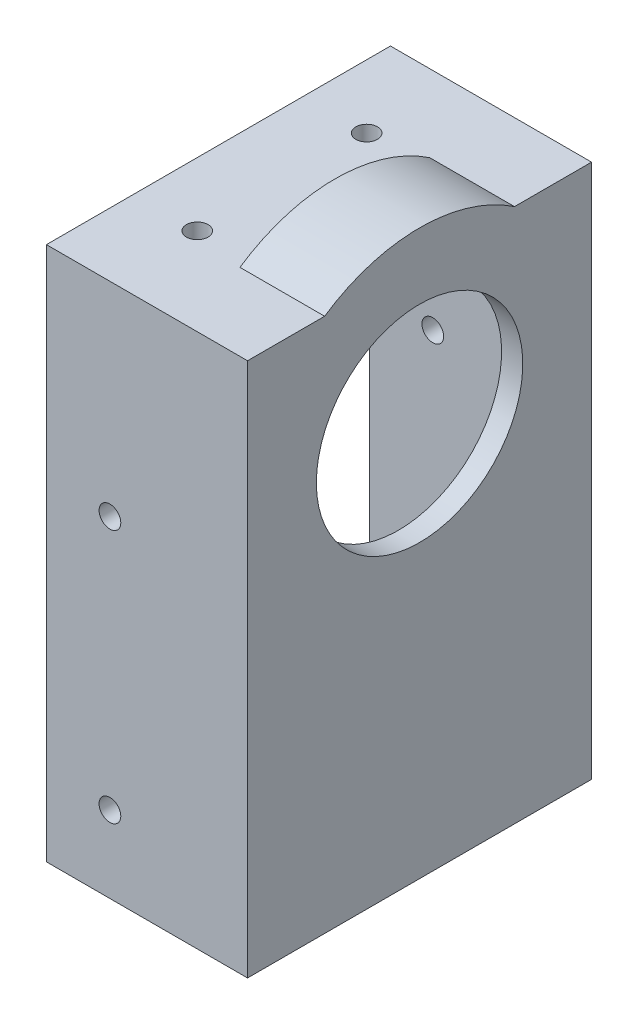
ISO-10303-21;
HEADER;
FILE_DESCRIPTION(('STEP AP214'),'2;1');
FILE_NAME('part.step','',(''),(''),'','','');
FILE_SCHEMA(('AUTOMOTIVE_DESIGN { 1 0 10303 214 1 1 1 1 }'));
ENDSEC;
DATA;
#1=APPLICATION_CONTEXT('core data for automotive mechanical design processes');
#2=APPLICATION_PROTOCOL_DEFINITION('international standard','automotive_design',2000,#1);
#3=PRODUCT_CONTEXT('',#1,'mechanical');
#4=PRODUCT('Part','Part','',(#3));
#5=PRODUCT_RELATED_PRODUCT_CATEGORY('part','',(#4));
#6=PRODUCT_DEFINITION_FORMATION('','',#4);
#7=PRODUCT_DEFINITION_CONTEXT('part definition',#1,'design');
#8=PRODUCT_DEFINITION('design','',#6,#7);
#9=PRODUCT_DEFINITION_SHAPE('','',#8);
#10=(LENGTH_UNIT() NAMED_UNIT(*) SI_UNIT(.MILLI.,.METRE.));
#11=(NAMED_UNIT(*) PLANE_ANGLE_UNIT() SI_UNIT($,.RADIAN.));
#12=(NAMED_UNIT(*) SI_UNIT($,.STERADIAN.) SOLID_ANGLE_UNIT());
#13=UNCERTAINTY_MEASURE_WITH_UNIT(LENGTH_MEASURE(1.E-05),#10,'distance_accuracy_value','');
#14=(GEOMETRIC_REPRESENTATION_CONTEXT(3) GLOBAL_UNCERTAINTY_ASSIGNED_CONTEXT((#13)) GLOBAL_UNIT_ASSIGNED_CONTEXT((#10,
#11,#12)) REPRESENTATION_CONTEXT('',''));
#15=CARTESIAN_POINT('',(0.,0.,0.));
#16=DIRECTION('',(0.,0.,1.));
#17=DIRECTION('',(1.,0.,0.));
#18=AXIS2_PLACEMENT_3D('',#15,#16,#17);
#19=CARTESIAN_POINT('',(0.,0.,0.));
#20=DIRECTION('',(1.,0.,0.));
#21=DIRECTION('',(0.,0.,-1.));
#22=AXIS2_PLACEMENT_3D('',#19,#20,#21);
#23=PLANE('',#22);
#24=DIRECTION('',(0.,-1.,0.));
#25=VECTOR('',#24,1.);
#26=CARTESIAN_POINT('',(0.,0.,2.));
#27=LINE('',#26,#25);
#28=CARTESIAN_POINT('',(0.,48.5,2.));
#29=VERTEX_POINT('',#28);
#30=CARTESIAN_POINT('',(0.,-2.,2.));
#31=VERTEX_POINT('',#30);
#32=EDGE_CURVE('E289',#29,#31,#27,.T.);
#33=ORIENTED_EDGE('',*,*,#32,.F.);
#34=DIRECTION('',(0.,0.,1.));
#35=VECTOR('',#34,1.);
#36=CARTESIAN_POINT('',(0.,48.5,0.));
#37=LINE('',#36,#35);
#38=CARTESIAN_POINT('',(0.,48.5,-30.5));
#39=VERTEX_POINT('',#38);
#40=EDGE_CURVE('E299',#39,#29,#37,.T.);
#41=ORIENTED_EDGE('',*,*,#40,.F.);
#42=DIRECTION('',(0.,1.,0.));
#43=VECTOR('',#42,1.);
#44=CARTESIAN_POINT('',(0.,0.,-30.5));
#45=LINE('',#44,#43);
#46=CARTESIAN_POINT('',(0.,-2.,-30.5));
#47=VERTEX_POINT('',#46);
#48=EDGE_CURVE('E296',#47,#39,#45,.T.);
#49=ORIENTED_EDGE('',*,*,#48,.F.);
#50=DIRECTION('',(0.,0.,-1.));
#51=VECTOR('',#50,1.);
#52=CARTESIAN_POINT('',(0.,-2.,0.));
#53=LINE('',#52,#51);
#54=EDGE_CURVE('E293',#31,#47,#53,.T.);
#55=ORIENTED_EDGE('',*,*,#54,.F.);
#56=EDGE_LOOP('',(#33,#41,#49,#55));
#57=FACE_BOUND('',#56,.T.);
#58=DIRECTION('',(0.,-1.,0.));
#59=VECTOR('',#58,1.);
#60=CARTESIAN_POINT('',(0.,0.,0.));
#61=LINE('',#60,#59);
#62=CARTESIAN_POINT('',(0.,46.5,0.));
#63=VERTEX_POINT('',#62);
#64=CARTESIAN_POINT('',(0.,0.,0.));
#65=VERTEX_POINT('',#64);
#66=EDGE_CURVE('E245',#63,#65,#61,.T.);
#67=ORIENTED_EDGE('',*,*,#66,.T.);
#68=DIRECTION('',(0.,0.,-1.));
#69=VECTOR('',#68,1.);
#70=CARTESIAN_POINT('',(0.,0.,0.));
#71=LINE('',#70,#69);
#72=CARTESIAN_POINT('',(0.,0.,-28.5));
#73=VERTEX_POINT('',#72);
#74=EDGE_CURVE('E265',#65,#73,#71,.T.);
#75=ORIENTED_EDGE('',*,*,#74,.T.);
#76=DIRECTION('',(0.,1.,0.));
#77=VECTOR('',#76,1.);
#78=CARTESIAN_POINT('',(0.,0.,-28.5));
#79=LINE('',#78,#77);
#80=CARTESIAN_POINT('',(0.,46.5,-28.5));
#81=VERTEX_POINT('',#80);
#82=EDGE_CURVE('E269',#73,#81,#79,.T.);
#83=ORIENTED_EDGE('',*,*,#82,.T.);
#84=DIRECTION('',(0.,0.,1.));
#85=VECTOR('',#84,1.);
#86=CARTESIAN_POINT('',(0.,46.5,0.));
#87=LINE('',#86,#85);
#88=EDGE_CURVE('E251',#81,#63,#87,.T.);
#89=ORIENTED_EDGE('',*,*,#88,.T.);
#90=EDGE_LOOP('',(#67,#75,#83,#89));
#91=FACE_BOUND('',#90,.T.);
#92=ADVANCED_FACE('F63',(#57,#91),#23,.F.);
#93=CARTESIAN_POINT('',(17.,0.,2.));
#94=DIRECTION('',(0.,0.,-1.));
#95=DIRECTION('',(-1.,0.,0.));
#96=AXIS2_PLACEMENT_3D('',#93,#94,#95);
#97=PLANE('',#96);
#98=CARTESIAN_POINT('',(6.,29.25,2.));
#99=DIRECTION('',(0.,0.,1.));
#100=DIRECTION('',(1.,0.,0.));
#101=AXIS2_PLACEMENT_3D('',#98,#99,#100);
#102=CIRCLE('',#101,1.025);
#103=CARTESIAN_POINT('',(7.025,29.25,2.));
#104=VERTEX_POINT('',#103);
#105=EDGE_CURVE('E219',#104,#104,#102,.T.);
#106=ORIENTED_EDGE('',*,*,#105,.F.);
#107=EDGE_LOOP('',(#106));
#108=FACE_BOUND('',#107,.T.);
#109=CARTESIAN_POINT('',(6.,5.25,2.));
#110=DIRECTION('',(0.,0.,1.));
#111=DIRECTION('',(1.,0.,0.));
#112=AXIS2_PLACEMENT_3D('',#109,#110,#111);
#113=CIRCLE('',#112,1.025);
#114=CARTESIAN_POINT('',(7.025,5.25,2.));
#115=VERTEX_POINT('',#114);
#116=EDGE_CURVE('E232',#115,#115,#113,.T.);
#117=ORIENTED_EDGE('',*,*,#116,.F.);
#118=EDGE_LOOP('',(#117));
#119=FACE_BOUND('',#118,.T.);
#120=ORIENTED_EDGE('',*,*,#32,.T.);
#121=DIRECTION('',(-1.,0.,0.));
#122=VECTOR('',#121,1.);
#123=CARTESIAN_POINT('',(17.,-2.,2.));
#124=LINE('',#123,#122);
#125=CARTESIAN_POINT('',(19.,-2.,2.));
#126=VERTEX_POINT('',#125);
#127=EDGE_CURVE('E12',#126,#31,#124,.T.);
#128=ORIENTED_EDGE('',*,*,#127,.F.);
#129=DIRECTION('',(0.,-1.,0.));
#130=VECTOR('',#129,1.);
#131=CARTESIAN_POINT('',(19.,-2.,2.));
#132=LINE('',#131,#130);
#133=CARTESIAN_POINT('',(19.,48.5,2.));
#134=VERTEX_POINT('',#133);
#135=EDGE_CURVE('E173',#134,#126,#132,.T.);
#136=ORIENTED_EDGE('',*,*,#135,.F.);
#137=DIRECTION('',(-1.,0.,0.));
#138=VECTOR('',#137,1.);
#139=CARTESIAN_POINT('',(17.,48.5,2.));
#140=LINE('',#139,#138);
#141=EDGE_CURVE('E302',#134,#29,#140,.T.);
#142=ORIENTED_EDGE('',*,*,#141,.T.);
#143=EDGE_LOOP('',(#120,#128,#136,#142));
#144=FACE_BOUND('',#143,.T.);
#145=ADVANCED_FACE('F65',(#108,#119,#144),#97,.F.);
#146=CARTESIAN_POINT('',(17.,-2.,0.));
#147=DIRECTION('',(0.,1.,0.));
#148=DIRECTION('',(0.,0.,1.));
#149=AXIS2_PLACEMENT_3D('',#146,#147,#148);
#150=PLANE('',#149);
#151=CARTESIAN_POINT('',(6.,-2.,-6.25));
#152=DIRECTION('',(0.,1.,0.));
#153=DIRECTION('',(0.,0.,1.));
#154=AXIS2_PLACEMENT_3D('',#151,#152,#153);
#155=CIRCLE('',#154,1.02499999999999);
#156=CARTESIAN_POINT('',(6.,-2.,-5.225));
#157=VERTEX_POINT('',#156);
#158=EDGE_CURVE('E195',#157,#157,#155,.T.);
#159=ORIENTED_EDGE('',*,*,#158,.T.);
#160=EDGE_LOOP('',(#159));
#161=FACE_BOUND('',#160,.T.);
#162=CARTESIAN_POINT('',(6.,-2.,-22.25));
#163=DIRECTION('',(0.,1.,0.));
#164=DIRECTION('',(0.,0.,1.));
#165=AXIS2_PLACEMENT_3D('',#162,#163,#164);
#166=CIRCLE('',#165,1.02499999999999);
#167=CARTESIAN_POINT('',(6.,-2.,-21.225));
#168=VERTEX_POINT('',#167);
#169=EDGE_CURVE('E211',#168,#168,#166,.T.);
#170=ORIENTED_EDGE('',*,*,#169,.T.);
#171=EDGE_LOOP('',(#170));
#172=FACE_BOUND('',#171,.T.);
#173=ORIENTED_EDGE('',*,*,#54,.T.);
#174=DIRECTION('',(-1.,0.,0.));
#175=VECTOR('',#174,1.);
#176=CARTESIAN_POINT('',(17.,-2.,-30.5));
#177=LINE('',#176,#175);
#178=CARTESIAN_POINT('',(19.,-2.,-30.5));
#179=VERTEX_POINT('',#178);
#180=EDGE_CURVE('E73',#179,#47,#177,.T.);
#181=ORIENTED_EDGE('',*,*,#180,.F.);
#182=DIRECTION('',(0.,0.,-1.));
#183=VECTOR('',#182,1.);
#184=CARTESIAN_POINT('',(19.,-2.,2.));
#185=LINE('',#184,#183);
#186=EDGE_CURVE('E180',#126,#179,#185,.T.);
#187=ORIENTED_EDGE('',*,*,#186,.F.);
#188=ORIENTED_EDGE('',*,*,#127,.T.);
#189=EDGE_LOOP('',(#173,#181,#187,#188));
#190=FACE_BOUND('',#189,.T.);
#191=ADVANCED_FACE('F357',(#161,#172,#190),#150,.F.);
#192=CARTESIAN_POINT('',(17.,0.,-30.5));
#193=DIRECTION('',(0.,0.,1.));
#194=DIRECTION('',(1.,0.,0.));
#195=AXIS2_PLACEMENT_3D('',#192,#193,#194);
#196=PLANE('',#195);
#197=CARTESIAN_POINT('',(6.,29.25,-30.5));
#198=DIRECTION('',(0.,0.,1.));
#199=DIRECTION('',(1.,0.,0.));
#200=AXIS2_PLACEMENT_3D('',#197,#198,#199);
#201=CIRCLE('',#200,1.025);
#202=CARTESIAN_POINT('',(7.025,29.25,-30.5));
#203=VERTEX_POINT('',#202);
#204=EDGE_CURVE('E223',#203,#203,#201,.T.);
#205=ORIENTED_EDGE('',*,*,#204,.T.);
#206=EDGE_LOOP('',(#205));
#207=FACE_BOUND('',#206,.T.);
#208=CARTESIAN_POINT('',(6.,5.25,-30.5));
#209=DIRECTION('',(0.,0.,1.));
#210=DIRECTION('',(1.,0.,0.));
#211=AXIS2_PLACEMENT_3D('',#208,#209,#210);
#212=CIRCLE('',#211,1.025);
#213=CARTESIAN_POINT('',(7.025,5.25,-30.5));
#214=VERTEX_POINT('',#213);
#215=EDGE_CURVE('E236',#214,#214,#212,.T.);
#216=ORIENTED_EDGE('',*,*,#215,.T.);
#217=EDGE_LOOP('',(#216));
#218=FACE_BOUND('',#217,.T.);
#219=ORIENTED_EDGE('',*,*,#48,.T.);
#220=DIRECTION('',(-1.,0.,0.));
#221=VECTOR('',#220,1.);
#222=CARTESIAN_POINT('',(17.,48.5,-30.5));
#223=LINE('',#222,#221);
#224=CARTESIAN_POINT('',(19.,48.5,-30.5));
#225=VERTEX_POINT('',#224);
#226=EDGE_CURVE('E306',#225,#39,#223,.T.);
#227=ORIENTED_EDGE('',*,*,#226,.F.);
#228=DIRECTION('',(0.,1.,0.));
#229=VECTOR('',#228,1.);
#230=CARTESIAN_POINT('',(19.,-2.,-30.5));
#231=LINE('',#230,#229);
#232=EDGE_CURVE('E184',#179,#225,#231,.T.);
#233=ORIENTED_EDGE('',*,*,#232,.F.);
#234=ORIENTED_EDGE('',*,*,#180,.T.);
#235=EDGE_LOOP('',(#219,#227,#233,#234));
#236=FACE_BOUND('',#235,.T.);
#237=ADVANCED_FACE('F363',(#207,#218,#236),#196,.F.);
#238=CARTESIAN_POINT('',(17.,48.5,0.));
#239=DIRECTION('',(0.,-1.,0.));
#240=DIRECTION('',(0.,0.,-1.));
#241=AXIS2_PLACEMENT_3D('',#238,#239,#240);
#242=PLANE('',#241);
#243=CARTESIAN_POINT('',(6.,48.5,-6.25));
#244=DIRECTION('',(0.,1.,0.));
#245=DIRECTION('',(0.,0.,1.));
#246=AXIS2_PLACEMENT_3D('',#243,#244,#245);
#247=CIRCLE('',#246,1.02499999999999);
#248=CARTESIAN_POINT('',(6.,48.5,-5.22500000000001));
#249=VERTEX_POINT('',#248);
#250=EDGE_CURVE('E191',#249,#249,#247,.T.);
#251=ORIENTED_EDGE('',*,*,#250,.F.);
#252=EDGE_LOOP('',(#251));
#253=FACE_BOUND('',#252,.T.);
#254=CARTESIAN_POINT('',(6.,48.5,-22.25));
#255=DIRECTION('',(0.,1.,0.));
#256=DIRECTION('',(0.,0.,1.));
#257=AXIS2_PLACEMENT_3D('',#254,#255,#256);
#258=CIRCLE('',#257,1.02499999999999);
#259=CARTESIAN_POINT('',(6.,48.5,-21.225));
#260=VERTEX_POINT('',#259);
#261=EDGE_CURVE('E207',#260,#260,#258,.T.);
#262=ORIENTED_EDGE('',*,*,#261,.F.);
#263=EDGE_LOOP('',(#262));
#264=FACE_BOUND('',#263,.T.);
#265=DIRECTION('',(0.,0.,-1.));
#266=VECTOR('',#265,1.);
#267=CARTESIAN_POINT('',(11.,48.5,-5.28130444267395));
#268=LINE('',#267,#266);
#269=CARTESIAN_POINT('',(11.,48.5,-5.28130444267395));
#270=VERTEX_POINT('',#269);
#271=CARTESIAN_POINT('',(11.,48.5,-23.2186955573261));
#272=VERTEX_POINT('',#271);
#273=EDGE_CURVE('E153',#270,#272,#268,.T.);
#274=ORIENTED_EDGE('',*,*,#273,.T.);
#275=DIRECTION('',(1.,0.,0.));
#276=VECTOR('',#275,1.);
#277=CARTESIAN_POINT('',(11.,48.5,-23.2186955573261));
#278=LINE('',#277,#276);
#279=CARTESIAN_POINT('',(19.,48.5,-23.2186955573261));
#280=VERTEX_POINT('',#279);
#281=EDGE_CURVE('E149',#272,#280,#278,.T.);
#282=ORIENTED_EDGE('',*,*,#281,.T.);
#283=DIRECTION('',(0.,0.,1.));
#284=VECTOR('',#283,1.);
#285=CARTESIAN_POINT('',(19.,48.5,2.));
#286=LINE('',#285,#284);
#287=EDGE_CURVE('E188',#225,#280,#286,.T.);
#288=ORIENTED_EDGE('',*,*,#287,.F.);
#289=ORIENTED_EDGE('',*,*,#226,.T.);
#290=ORIENTED_EDGE('',*,*,#40,.T.);
#291=ORIENTED_EDGE('',*,*,#141,.F.);
#292=CARTESIAN_POINT('',(19.,48.5,-5.28130444267395));
#293=VERTEX_POINT('',#292);
#294=EDGE_CURVE('E161',#293,#134,#286,.T.);
#295=ORIENTED_EDGE('',*,*,#294,.F.);
#296=DIRECTION('',(1.,0.,0.));
#297=VECTOR('',#296,1.);
#298=CARTESIAN_POINT('',(11.,48.5,-5.28130444267395));
#299=LINE('',#298,#297);
#300=EDGE_CURVE('E146',#270,#293,#299,.T.);
#301=ORIENTED_EDGE('',*,*,#300,.F.);
#302=EDGE_LOOP('',(#274,#282,#288,#289,#290,#291,#295,#301));
#303=FACE_BOUND('',#302,.T.);
#304=ADVANCED_FACE('F159',(#253,#264,#303),#242,.F.);
#305=CARTESIAN_POINT('',(17.,0.,0.));
#306=DIRECTION('',(0.,0.,-1.));
#307=DIRECTION('',(-1.,0.,0.));
#308=AXIS2_PLACEMENT_3D('',#305,#306,#307);
#309=PLANE('',#308);
#310=CARTESIAN_POINT('',(6.,29.25,0.));
#311=DIRECTION('',(0.,0.,-1.));
#312=DIRECTION('',(-1.,0.,0.));
#313=AXIS2_PLACEMENT_3D('',#310,#311,#312);
#314=CIRCLE('',#313,1.025);
#315=CARTESIAN_POINT('',(4.975,29.25,0.));
#316=VERTEX_POINT('',#315);
#317=EDGE_CURVE('E227',#316,#316,#314,.T.);
#318=ORIENTED_EDGE('',*,*,#317,.F.);
#319=EDGE_LOOP('',(#318));
#320=FACE_BOUND('',#319,.T.);
#321=CARTESIAN_POINT('',(6.,5.25,0.));
#322=DIRECTION('',(0.,0.,-1.));
#323=DIRECTION('',(-1.,0.,0.));
#324=AXIS2_PLACEMENT_3D('',#321,#322,#323);
#325=CIRCLE('',#324,1.025);
#326=CARTESIAN_POINT('',(4.975,5.25,0.));
#327=VERTEX_POINT('',#326);
#328=EDGE_CURVE('E240',#327,#327,#325,.T.);
#329=ORIENTED_EDGE('',*,*,#328,.F.);
#330=EDGE_LOOP('',(#329));
#331=FACE_BOUND('',#330,.T.);
#332=ORIENTED_EDGE('',*,*,#66,.F.);
#333=DIRECTION('',(-1.,0.,0.));
#334=VECTOR('',#333,1.);
#335=CARTESIAN_POINT('',(17.,46.5,0.));
#336=LINE('',#335,#334);
#337=CARTESIAN_POINT('',(17.,46.5,0.));
#338=VERTEX_POINT('',#337);
#339=EDGE_CURVE('E261',#338,#63,#336,.T.);
#340=ORIENTED_EDGE('',*,*,#339,.F.);
#341=DIRECTION('',(0.,-1.,0.));
#342=VECTOR('',#341,1.);
#343=CARTESIAN_POINT('',(17.,0.,0.));
#344=LINE('',#343,#342);
#345=CARTESIAN_POINT('',(17.,0.,0.));
#346=VERTEX_POINT('',#345);
#347=EDGE_CURVE('E246',#338,#346,#344,.T.);
#348=ORIENTED_EDGE('',*,*,#347,.T.);
#349=DIRECTION('',(-1.,0.,0.));
#350=VECTOR('',#349,1.);
#351=CARTESIAN_POINT('',(17.,0.,0.));
#352=LINE('',#351,#350);
#353=EDGE_CURVE('E285',#346,#65,#352,.T.);
#354=ORIENTED_EDGE('',*,*,#353,.T.);
#355=EDGE_LOOP('',(#332,#340,#348,#354));
#356=FACE_BOUND('',#355,.T.);
#357=ADVANCED_FACE('F322',(#320,#331,#356),#309,.T.);
#358=CARTESIAN_POINT('',(17.,0.,0.));
#359=DIRECTION('',(0.,1.,0.));
#360=DIRECTION('',(0.,0.,1.));
#361=AXIS2_PLACEMENT_3D('',#358,#359,#360);
#362=PLANE('',#361);
#363=CARTESIAN_POINT('',(6.,0.,-6.25));
#364=DIRECTION('',(0.,1.,0.));
#365=DIRECTION('',(0.,0.,1.));
#366=AXIS2_PLACEMENT_3D('',#363,#364,#365);
#367=CIRCLE('',#366,1.02499999999999);
#368=CARTESIAN_POINT('',(6.,0.,-5.22500000000001));
#369=VERTEX_POINT('',#368);
#370=EDGE_CURVE('E203',#369,#369,#367,.T.);
#371=ORIENTED_EDGE('',*,*,#370,.F.);
#372=EDGE_LOOP('',(#371));
#373=FACE_BOUND('',#372,.T.);
#374=CARTESIAN_POINT('',(6.,0.,-22.25));
#375=DIRECTION('',(0.,1.,0.));
#376=DIRECTION('',(0.,0.,1.));
#377=AXIS2_PLACEMENT_3D('',#374,#375,#376);
#378=CIRCLE('',#377,1.02499999999999);
#379=CARTESIAN_POINT('',(6.,0.,-21.225));
#380=VERTEX_POINT('',#379);
#381=EDGE_CURVE('E67',#380,#380,#378,.T.);
#382=ORIENTED_EDGE('',*,*,#381,.F.);
#383=EDGE_LOOP('',(#382));
#384=FACE_BOUND('',#383,.T.);
#385=ORIENTED_EDGE('',*,*,#74,.F.);
#386=ORIENTED_EDGE('',*,*,#353,.F.);
#387=DIRECTION('',(0.,0.,-1.));
#388=VECTOR('',#387,1.);
#389=CARTESIAN_POINT('',(17.,0.,0.));
#390=LINE('',#389,#388);
#391=CARTESIAN_POINT('',(17.,0.,-28.5));
#392=VERTEX_POINT('',#391);
#393=EDGE_CURVE('E250',#346,#392,#390,.T.);
#394=ORIENTED_EDGE('',*,*,#393,.T.);
#395=DIRECTION('',(-1.,0.,0.));
#396=VECTOR('',#395,1.);
#397=CARTESIAN_POINT('',(17.,0.,-28.5));
#398=LINE('',#397,#396);
#399=EDGE_CURVE('E282',#392,#73,#398,.T.);
#400=ORIENTED_EDGE('',*,*,#399,.T.);
#401=EDGE_LOOP('',(#385,#386,#394,#400));
#402=FACE_BOUND('',#401,.T.);
#403=ADVANCED_FACE('F325',(#373,#384,#402),#362,.T.);
#404=CARTESIAN_POINT('',(17.,0.,-28.5));
#405=DIRECTION('',(0.,0.,1.));
#406=DIRECTION('',(1.,0.,0.));
#407=AXIS2_PLACEMENT_3D('',#404,#405,#406);
#408=PLANE('',#407);
#409=CARTESIAN_POINT('',(6.,29.25,-28.5));
#410=DIRECTION('',(0.,0.,1.));
#411=DIRECTION('',(1.,0.,0.));
#412=AXIS2_PLACEMENT_3D('',#409,#410,#411);
#413=CIRCLE('',#412,1.025);
#414=CARTESIAN_POINT('',(7.025,29.25,-28.5));
#415=VERTEX_POINT('',#414);
#416=EDGE_CURVE('E228',#415,#415,#413,.T.);
#417=ORIENTED_EDGE('',*,*,#416,.F.);
#418=EDGE_LOOP('',(#417));
#419=FACE_BOUND('',#418,.T.);
#420=CARTESIAN_POINT('',(6.,5.25,-28.5));
#421=DIRECTION('',(0.,0.,1.));
#422=DIRECTION('',(1.,0.,0.));
#423=AXIS2_PLACEMENT_3D('',#420,#421,#422);
#424=CIRCLE('',#423,1.025);
#425=CARTESIAN_POINT('',(7.025,5.25,-28.5));
#426=VERTEX_POINT('',#425);
#427=EDGE_CURVE('E241',#426,#426,#424,.T.);
#428=ORIENTED_EDGE('',*,*,#427,.F.);
#429=EDGE_LOOP('',(#428));
#430=FACE_BOUND('',#429,.T.);
#431=ORIENTED_EDGE('',*,*,#82,.F.);
#432=ORIENTED_EDGE('',*,*,#399,.F.);
#433=DIRECTION('',(0.,1.,0.));
#434=VECTOR('',#433,1.);
#435=CARTESIAN_POINT('',(17.,0.,-28.5));
#436=LINE('',#435,#434);
#437=CARTESIAN_POINT('',(17.,46.5,-28.5));
#438=VERTEX_POINT('',#437);
#439=EDGE_CURVE('E255',#392,#438,#436,.T.);
#440=ORIENTED_EDGE('',*,*,#439,.T.);
#441=DIRECTION('',(-1.,0.,0.));
#442=VECTOR('',#441,1.);
#443=CARTESIAN_POINT('',(17.,46.5,-28.5));
#444=LINE('',#443,#442);
#445=EDGE_CURVE('E279',#438,#81,#444,.T.);
#446=ORIENTED_EDGE('',*,*,#445,.T.);
#447=EDGE_LOOP('',(#431,#432,#440,#446));
#448=FACE_BOUND('',#447,.T.);
#449=ADVANCED_FACE('F338',(#419,#430,#448),#408,.T.);
#450=CARTESIAN_POINT('',(17.,46.5,0.));
#451=DIRECTION('',(0.,-1.,0.));
#452=DIRECTION('',(0.,0.,-1.));
#453=AXIS2_PLACEMENT_3D('',#450,#451,#452);
#454=PLANE('',#453);
#455=CARTESIAN_POINT('',(6.,46.5,-6.25));
#456=DIRECTION('',(0.,-1.,0.));
#457=DIRECTION('',(0.,0.,-1.));
#458=AXIS2_PLACEMENT_3D('',#455,#456,#457);
#459=CIRCLE('',#458,1.02499999999999);
#460=CARTESIAN_POINT('',(6.,46.5,-7.27499999999999));
#461=VERTEX_POINT('',#460);
#462=EDGE_CURVE('E199',#461,#461,#459,.T.);
#463=ORIENTED_EDGE('',*,*,#462,.F.);
#464=EDGE_LOOP('',(#463));
#465=FACE_BOUND('',#464,.T.);
#466=CARTESIAN_POINT('',(6.,46.5,-22.25));
#467=DIRECTION('',(0.,-1.,0.));
#468=DIRECTION('',(0.,0.,-1.));
#469=AXIS2_PLACEMENT_3D('',#466,#467,#468);
#470=CIRCLE('',#469,1.02499999999999);
#471=CARTESIAN_POINT('',(6.,46.5,-23.275));
#472=VERTEX_POINT('',#471);
#473=EDGE_CURVE('E215',#472,#472,#470,.T.);
#474=ORIENTED_EDGE('',*,*,#473,.F.);
#475=EDGE_LOOP('',(#474));
#476=FACE_BOUND('',#475,.T.);
#477=ORIENTED_EDGE('',*,*,#88,.F.);
#478=ORIENTED_EDGE('',*,*,#445,.F.);
#479=DIRECTION('',(0.,0.,1.));
#480=VECTOR('',#479,1.);
#481=CARTESIAN_POINT('',(17.,46.5,0.));
#482=LINE('',#481,#480);
#483=EDGE_CURVE('E89',#438,#338,#482,.T.);
#484=ORIENTED_EDGE('',*,*,#483,.T.);
#485=ORIENTED_EDGE('',*,*,#339,.T.);
#486=EDGE_LOOP('',(#477,#478,#484,#485));
#487=FACE_BOUND('',#486,.T.);
#488=ADVANCED_FACE('F334',(#465,#476,#487),#454,.T.);
#489=CARTESIAN_POINT('',(6.,5.25,2.));
#490=DIRECTION('',(0.,0.,1.));
#491=DIRECTION('',(1.,0.,0.));
#492=AXIS2_PLACEMENT_3D('',#489,#490,#491);
#493=CYLINDRICAL_SURFACE('',#492,1.025);
#494=ORIENTED_EDGE('',*,*,#328,.T.);
#495=EDGE_LOOP('',(#494));
#496=FACE_BOUND('',#495,.T.);
#497=ORIENTED_EDGE('',*,*,#116,.T.);
#498=EDGE_LOOP('',(#497));
#499=FACE_BOUND('',#498,.T.);
#500=ADVANCED_FACE('F408',(#496,#499),#493,.F.);
#501=ORIENTED_EDGE('',*,*,#427,.T.);
#502=EDGE_LOOP('',(#501));
#503=FACE_BOUND('',#502,.T.);
#504=ORIENTED_EDGE('',*,*,#215,.F.);
#505=EDGE_LOOP('',(#504));
#506=FACE_BOUND('',#505,.T.);
#507=ADVANCED_FACE('F407',(#503,#506),#493,.F.);
#508=CARTESIAN_POINT('',(6.,29.25,2.));
#509=DIRECTION('',(0.,0.,1.));
#510=DIRECTION('',(1.,0.,0.));
#511=AXIS2_PLACEMENT_3D('',#508,#509,#510);
#512=CYLINDRICAL_SURFACE('',#511,1.025);
#513=ORIENTED_EDGE('',*,*,#317,.T.);
#514=EDGE_LOOP('',(#513));
#515=FACE_BOUND('',#514,.T.);
#516=ORIENTED_EDGE('',*,*,#105,.T.);
#517=EDGE_LOOP('',(#516));
#518=FACE_BOUND('',#517,.T.);
#519=ADVANCED_FACE('F319',(#515,#518),#512,.F.);
#520=ORIENTED_EDGE('',*,*,#416,.T.);
#521=EDGE_LOOP('',(#520));
#522=FACE_BOUND('',#521,.T.);
#523=ORIENTED_EDGE('',*,*,#204,.F.);
#524=EDGE_LOOP('',(#523));
#525=FACE_BOUND('',#524,.T.);
#526=ADVANCED_FACE('F393',(#522,#525),#512,.F.);
#527=CARTESIAN_POINT('',(6.,48.5,-22.25));
#528=DIRECTION('',(0.,1.,0.));
#529=DIRECTION('',(0.,0.,1.));
#530=AXIS2_PLACEMENT_3D('',#527,#528,#529);
#531=CYLINDRICAL_SURFACE('',#530,1.02499999999999);
#532=ORIENTED_EDGE('',*,*,#381,.T.);
#533=EDGE_LOOP('',(#532));
#534=FACE_BOUND('',#533,.T.);
#535=ORIENTED_EDGE('',*,*,#169,.F.);
#536=EDGE_LOOP('',(#535));
#537=FACE_BOUND('',#536,.T.);
#538=ADVANCED_FACE('F389',(#534,#537),#531,.F.);
#539=ORIENTED_EDGE('',*,*,#473,.T.);
#540=EDGE_LOOP('',(#539));
#541=FACE_BOUND('',#540,.T.);
#542=ORIENTED_EDGE('',*,*,#261,.T.);
#543=EDGE_LOOP('',(#542));
#544=FACE_BOUND('',#543,.T.);
#545=ADVANCED_FACE('F392',(#541,#544),#531,.F.);
#546=CARTESIAN_POINT('',(6.,48.5,-6.25));
#547=DIRECTION('',(0.,1.,0.));
#548=DIRECTION('',(0.,0.,1.));
#549=AXIS2_PLACEMENT_3D('',#546,#547,#548);
#550=CYLINDRICAL_SURFACE('',#549,1.02499999999999);
#551=ORIENTED_EDGE('',*,*,#462,.T.);
#552=EDGE_LOOP('',(#551));
#553=FACE_BOUND('',#552,.T.);
#554=ORIENTED_EDGE('',*,*,#250,.T.);
#555=EDGE_LOOP('',(#554));
#556=FACE_BOUND('',#555,.T.);
#557=ADVANCED_FACE('F399',(#553,#556),#550,.F.);
#558=ORIENTED_EDGE('',*,*,#370,.T.);
#559=EDGE_LOOP('',(#558));
#560=FACE_BOUND('',#559,.T.);
#561=ORIENTED_EDGE('',*,*,#158,.F.);
#562=EDGE_LOOP('',(#561));
#563=FACE_BOUND('',#562,.T.);
#564=ADVANCED_FACE('F425',(#560,#563),#550,.F.);
#565=CARTESIAN_POINT('',(17.,0.,0.));
#566=DIRECTION('',(-1.,0.,0.));
#567=DIRECTION('',(0.,0.,1.));
#568=AXIS2_PLACEMENT_3D('',#565,#566,#567);
#569=PLANE('',#568);
#570=CARTESIAN_POINT('',(17.,35.25,-14.25));
#571=DIRECTION('',(-1.,0.,0.));
#572=DIRECTION('',(0.,0.,1.));
#573=AXIS2_PLACEMENT_3D('',#570,#571,#572);
#574=CIRCLE('',#573,9.75);
#575=CARTESIAN_POINT('',(17.,35.25,-4.5));
#576=VERTEX_POINT('',#575);
#577=EDGE_CURVE('E165',#576,#576,#574,.T.);
#578=ORIENTED_EDGE('',*,*,#577,.F.);
#579=EDGE_LOOP('',(#578));
#580=FACE_BOUND('',#579,.T.);
#581=ORIENTED_EDGE('',*,*,#393,.F.);
#582=ORIENTED_EDGE('',*,*,#347,.F.);
#583=ORIENTED_EDGE('',*,*,#483,.F.);
#584=ORIENTED_EDGE('',*,*,#439,.F.);
#585=EDGE_LOOP('',(#581,#582,#583,#584));
#586=FACE_BOUND('',#585,.T.);
#587=ADVANCED_FACE('F339',(#580,#586),#569,.T.);
#588=CARTESIAN_POINT('',(19.,0.,0.));
#589=DIRECTION('',(-1.,0.,0.));
#590=DIRECTION('',(0.,0.,1.));
#591=AXIS2_PLACEMENT_3D('',#588,#589,#590);
#592=PLANE('',#591);
#593=CARTESIAN_POINT('',(19.,35.25,-14.25));
#594=DIRECTION('',(-1.,0.,0.));
#595=DIRECTION('',(0.,0.,1.));
#596=AXIS2_PLACEMENT_3D('',#593,#594,#595);
#597=CIRCLE('',#596,9.75);
#598=CARTESIAN_POINT('',(19.,35.25,-4.5));
#599=VERTEX_POINT('',#598);
#600=EDGE_CURVE('E169',#599,#599,#597,.T.);
#601=ORIENTED_EDGE('',*,*,#600,.T.);
#602=EDGE_LOOP('',(#601));
#603=FACE_BOUND('',#602,.T.);
#604=ORIENTED_EDGE('',*,*,#135,.T.);
#605=ORIENTED_EDGE('',*,*,#186,.T.);
#606=ORIENTED_EDGE('',*,*,#232,.T.);
#607=ORIENTED_EDGE('',*,*,#287,.T.);
#608=CARTESIAN_POINT('',(19.,35.25,-14.25));
#609=DIRECTION('',(1.,0.,0.));
#610=DIRECTION('',(0.,0.,-1.));
#611=AXIS2_PLACEMENT_3D('',#608,#609,#610);
#612=CIRCLE('',#611,16.);
#613=EDGE_CURVE('E81',#280,#293,#612,.T.);
#614=ORIENTED_EDGE('',*,*,#613,.T.);
#615=ORIENTED_EDGE('',*,*,#294,.T.);
#616=EDGE_LOOP('',(#604,#605,#606,#607,#614,#615));
#617=FACE_BOUND('',#616,.T.);
#618=ADVANCED_FACE('F383',(#603,#617),#592,.F.);
#619=CARTESIAN_POINT('',(19.,35.25,-14.25));
#620=DIRECTION('',(-1.,0.,0.));
#621=DIRECTION('',(0.,0.,1.));
#622=AXIS2_PLACEMENT_3D('',#619,#620,#621);
#623=CYLINDRICAL_SURFACE('',#622,9.75);
#624=ORIENTED_EDGE('',*,*,#600,.F.);
#625=EDGE_LOOP('',(#624));
#626=FACE_BOUND('',#625,.T.);
#627=ORIENTED_EDGE('',*,*,#577,.T.);
#628=EDGE_LOOP('',(#627));
#629=FACE_BOUND('',#628,.T.);
#630=ADVANCED_FACE('F439',(#626,#629),#623,.F.);
#631=CARTESIAN_POINT('',(11.,35.25,-14.25));
#632=DIRECTION('',(1.,0.,0.));
#633=DIRECTION('',(0.,0.,-1.));
#634=AXIS2_PLACEMENT_3D('',#631,#632,#633);
#635=CYLINDRICAL_SURFACE('',#634,16.);
#636=ORIENTED_EDGE('',*,*,#613,.F.);
#637=ORIENTED_EDGE('',*,*,#281,.F.);
#638=CARTESIAN_POINT('',(11.,35.25,-14.25));
#639=DIRECTION('',(1.,0.,0.));
#640=DIRECTION('',(0.,0.,-1.));
#641=AXIS2_PLACEMENT_3D('',#638,#639,#640);
#642=CIRCLE('',#641,16.);
#643=EDGE_CURVE('E142',#272,#270,#642,.T.);
#644=ORIENTED_EDGE('',*,*,#643,.T.);
#645=ORIENTED_EDGE('',*,*,#300,.T.);
#646=EDGE_LOOP('',(#636,#637,#644,#645));
#647=FACE_BOUND('',#646,.T.);
#648=ADVANCED_FACE('F144',(#647),#635,.T.);
#649=CARTESIAN_POINT('',(11.,35.25,-14.25));
#650=DIRECTION('',(1.,0.,0.));
#651=DIRECTION('',(0.,0.,-1.));
#652=AXIS2_PLACEMENT_3D('',#649,#650,#651);
#653=PLANE('',#652);
#654=ORIENTED_EDGE('',*,*,#643,.F.);
#655=ORIENTED_EDGE('',*,*,#273,.F.);
#656=EDGE_LOOP('',(#654,#655));
#657=FACE_BOUND('',#656,.T.);
#658=ADVANCED_FACE('F155',(#657),#653,.F.);
#659=CLOSED_SHELL('',(#92,#145,#191,#237,#304,#357,#403,#449,#488,#500,#507,#519,#526,#538,#545,
#557,#564,#587,#618,#630,#648,#658));
#660=MANIFOLD_SOLID_BREP('B2',#659);
#661=ADVANCED_BREP_SHAPE_REPRESENTATION('',(#18,#660),#14);
#662=SHAPE_DEFINITION_REPRESENTATION(#9,#661);
ENDSEC;
END-ISO-10303-21;
